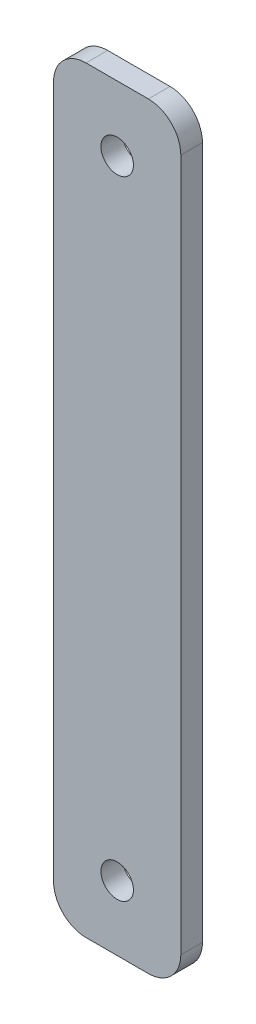
ISO-10303-21;
HEADER;
FILE_DESCRIPTION(('STEP AP214'),'2;1');
FILE_NAME('part.step','',(''),(''),'','','');
FILE_SCHEMA(('AUTOMOTIVE_DESIGN { 1 0 10303 214 1 1 1 1 }'));
ENDSEC;
DATA;
#1=APPLICATION_CONTEXT('core data for automotive mechanical design processes');
#2=APPLICATION_PROTOCOL_DEFINITION('international standard','automotive_design',2000,#1);
#3=PRODUCT_CONTEXT('',#1,'mechanical');
#4=PRODUCT('Part','Part','',(#3));
#5=PRODUCT_RELATED_PRODUCT_CATEGORY('part','',(#4));
#6=PRODUCT_DEFINITION_FORMATION('','',#4);
#7=PRODUCT_DEFINITION_CONTEXT('part definition',#1,'design');
#8=PRODUCT_DEFINITION('design','',#6,#7);
#9=PRODUCT_DEFINITION_SHAPE('','',#8);
#10=(LENGTH_UNIT() NAMED_UNIT(*) SI_UNIT(.MILLI.,.METRE.));
#11=(NAMED_UNIT(*) PLANE_ANGLE_UNIT() SI_UNIT($,.RADIAN.));
#12=(NAMED_UNIT(*) SI_UNIT($,.STERADIAN.) SOLID_ANGLE_UNIT());
#13=UNCERTAINTY_MEASURE_WITH_UNIT(LENGTH_MEASURE(1.E-05),#10,'distance_accuracy_value','');
#14=(GEOMETRIC_REPRESENTATION_CONTEXT(3) GLOBAL_UNCERTAINTY_ASSIGNED_CONTEXT((#13)) GLOBAL_UNIT_ASSIGNED_CONTEXT((#10,
#11,#12)) REPRESENTATION_CONTEXT('',''));
#15=CARTESIAN_POINT('',(0.,0.,0.));
#16=DIRECTION('',(0.,0.,1.));
#17=DIRECTION('',(1.,0.,0.));
#18=AXIS2_PLACEMENT_3D('',#15,#16,#17);
#19=CARTESIAN_POINT('',(-2.88,32.,2.));
#20=DIRECTION('',(0.,0.,1.));
#21=DIRECTION('',(1.,0.,0.));
#22=AXIS2_PLACEMENT_3D('',#19,#20,#21);
#23=PLANE('',#22);
#24=CARTESIAN_POINT('',(0.,-29.,2.));
#25=DIRECTION('',(0.,0.,1.));
#26=DIRECTION('',(1.,0.,0.));
#27=AXIS2_PLACEMENT_3D('',#24,#25,#26);
#28=CIRCLE('',#27,1.5);
#29=CARTESIAN_POINT('',(1.5,-29.,2.));
#30=VERTEX_POINT('',#29);
#31=EDGE_CURVE('E134',#30,#30,#28,.T.);
#32=ORIENTED_EDGE('',*,*,#31,.F.);
#33=EDGE_LOOP('',(#32));
#34=FACE_BOUND('',#33,.T.);
#35=CARTESIAN_POINT('',(-2.88,32.,2.));
#36=DIRECTION('',(0.,0.,1.));
#37=DIRECTION('',(1.,0.,0.));
#38=AXIS2_PLACEMENT_3D('',#35,#36,#37);
#39=CIRCLE('',#38,3.);
#40=CARTESIAN_POINT('',(-2.87999999999998,35.,2.));
#41=VERTEX_POINT('',#40);
#42=CARTESIAN_POINT('',(-5.88,32.,2.));
#43=VERTEX_POINT('',#42);
#44=EDGE_CURVE('E145',#41,#43,#39,.T.);
#45=ORIENTED_EDGE('',*,*,#44,.T.);
#46=DIRECTION('',(0.,-1.,0.));
#47=VECTOR('',#46,1.);
#48=CARTESIAN_POINT('',(-5.88,-32.,2.));
#49=LINE('',#48,#47);
#50=CARTESIAN_POINT('',(-5.88,-32.,2.));
#51=VERTEX_POINT('',#50);
#52=EDGE_CURVE('E93',#43,#51,#49,.T.);
#53=ORIENTED_EDGE('',*,*,#52,.T.);
#54=CARTESIAN_POINT('',(-2.88,-32.,2.));
#55=DIRECTION('',(0.,0.,1.));
#56=DIRECTION('',(-1.,0.,0.));
#57=AXIS2_PLACEMENT_3D('',#54,#55,#56);
#58=CIRCLE('',#57,3.);
#59=CARTESIAN_POINT('',(-2.87999999999998,-35.,2.));
#60=VERTEX_POINT('',#59);
#61=EDGE_CURVE('E160',#51,#60,#58,.T.);
#62=ORIENTED_EDGE('',*,*,#61,.T.);
#63=DIRECTION('',(1.,0.,0.));
#64=VECTOR('',#63,1.);
#65=CARTESIAN_POINT('',(2.87999999999998,-35.,2.));
#66=LINE('',#65,#64);
#67=CARTESIAN_POINT('',(2.87999999999998,-35.,2.));
#68=VERTEX_POINT('',#67);
#69=EDGE_CURVE('E173',#60,#68,#66,.T.);
#70=ORIENTED_EDGE('',*,*,#69,.T.);
#71=CARTESIAN_POINT('',(2.88,-32.,2.));
#72=DIRECTION('',(0.,0.,1.));
#73=DIRECTION('',(1.,0.,0.));
#74=AXIS2_PLACEMENT_3D('',#71,#72,#73);
#75=CIRCLE('',#74,3.);
#76=CARTESIAN_POINT('',(5.88,-32.,2.));
#77=VERTEX_POINT('',#76);
#78=EDGE_CURVE('E112',#68,#77,#75,.T.);
#79=ORIENTED_EDGE('',*,*,#78,.T.);
#80=DIRECTION('',(0.,1.,0.));
#81=VECTOR('',#80,1.);
#82=CARTESIAN_POINT('',(5.88,-32.,2.));
#83=LINE('',#82,#81);
#84=CARTESIAN_POINT('',(5.88,32.,2.));
#85=VERTEX_POINT('',#84);
#86=EDGE_CURVE('E106',#77,#85,#83,.T.);
#87=ORIENTED_EDGE('',*,*,#86,.T.);
#88=CARTESIAN_POINT('',(2.88,32.,2.));
#89=DIRECTION('',(0.,0.,1.));
#90=DIRECTION('',(1.,0.,0.));
#91=AXIS2_PLACEMENT_3D('',#88,#89,#90);
#92=CIRCLE('',#91,3.);
#93=CARTESIAN_POINT('',(2.87999999999998,35.,2.));
#94=VERTEX_POINT('',#93);
#95=EDGE_CURVE('E110',#85,#94,#92,.T.);
#96=ORIENTED_EDGE('',*,*,#95,.T.);
#97=DIRECTION('',(-1.,0.,0.));
#98=VECTOR('',#97,1.);
#99=CARTESIAN_POINT('',(2.87999999999998,35.,2.));
#100=LINE('',#99,#98);
#101=EDGE_CURVE('E50',#94,#41,#100,.T.);
#102=ORIENTED_EDGE('',*,*,#101,.T.);
#103=EDGE_LOOP('',(#45,#53,#62,#70,#79,#87,#96,#102));
#104=FACE_BOUND('',#103,.T.);
#105=CARTESIAN_POINT('',(0.,29.,2.));
#106=DIRECTION('',(0.,0.,1.));
#107=DIRECTION('',(1.,0.,0.));
#108=AXIS2_PLACEMENT_3D('',#105,#106,#107);
#109=CIRCLE('',#108,1.5);
#110=CARTESIAN_POINT('',(1.5,29.,2.));
#111=VERTEX_POINT('',#110);
#112=EDGE_CURVE('E182',#111,#111,#109,.T.);
#113=ORIENTED_EDGE('',*,*,#112,.F.);
#114=EDGE_LOOP('',(#113));
#115=FACE_BOUND('',#114,.T.);
#116=ADVANCED_FACE('F33',(#34,#104,#115),#23,.T.);
#117=CARTESIAN_POINT('',(-2.88,32.,0.));
#118=DIRECTION('',(0.,0.,1.));
#119=DIRECTION('',(1.,0.,0.));
#120=AXIS2_PLACEMENT_3D('',#117,#118,#119);
#121=PLANE('',#120);
#122=CARTESIAN_POINT('',(-2.88,32.,0.));
#123=DIRECTION('',(0.,0.,1.));
#124=DIRECTION('',(1.,0.,0.));
#125=AXIS2_PLACEMENT_3D('',#122,#123,#124);
#126=CIRCLE('',#125,3.);
#127=CARTESIAN_POINT('',(-2.87999999999998,35.,0.));
#128=VERTEX_POINT('',#127);
#129=CARTESIAN_POINT('',(-5.88,32.,0.));
#130=VERTEX_POINT('',#129);
#131=EDGE_CURVE('E130',#128,#130,#126,.T.);
#132=ORIENTED_EDGE('',*,*,#131,.F.);
#133=DIRECTION('',(-1.,0.,0.));
#134=VECTOR('',#133,1.);
#135=CARTESIAN_POINT('',(2.87999999999998,35.,0.));
#136=LINE('',#135,#134);
#137=CARTESIAN_POINT('',(2.87999999999998,35.,0.));
#138=VERTEX_POINT('',#137);
#139=EDGE_CURVE('E85',#138,#128,#136,.T.);
#140=ORIENTED_EDGE('',*,*,#139,.F.);
#141=CARTESIAN_POINT('',(2.88,32.,0.));
#142=DIRECTION('',(0.,0.,1.));
#143=DIRECTION('',(1.,0.,0.));
#144=AXIS2_PLACEMENT_3D('',#141,#142,#143);
#145=CIRCLE('',#144,3.);
#146=CARTESIAN_POINT('',(5.88,32.,0.));
#147=VERTEX_POINT('',#146);
#148=EDGE_CURVE('E79',#147,#138,#145,.T.);
#149=ORIENTED_EDGE('',*,*,#148,.F.);
#150=DIRECTION('',(0.,1.,0.));
#151=VECTOR('',#150,1.);
#152=CARTESIAN_POINT('',(5.88,-32.,0.));
#153=LINE('',#152,#151);
#154=CARTESIAN_POINT('',(5.88,-32.,0.));
#155=VERTEX_POINT('',#154);
#156=EDGE_CURVE('E120',#155,#147,#153,.T.);
#157=ORIENTED_EDGE('',*,*,#156,.F.);
#158=CARTESIAN_POINT('',(2.88,-32.,0.));
#159=DIRECTION('',(0.,0.,1.));
#160=DIRECTION('',(1.,0.,0.));
#161=AXIS2_PLACEMENT_3D('',#158,#159,#160);
#162=CIRCLE('',#161,3.);
#163=CARTESIAN_POINT('',(2.87999999999998,-35.,0.));
#164=VERTEX_POINT('',#163);
#165=EDGE_CURVE('E140',#164,#155,#162,.T.);
#166=ORIENTED_EDGE('',*,*,#165,.F.);
#167=DIRECTION('',(1.,0.,0.));
#168=VECTOR('',#167,1.);
#169=CARTESIAN_POINT('',(2.87999999999998,-35.,0.));
#170=LINE('',#169,#168);
#171=CARTESIAN_POINT('',(-2.87999999999998,-35.,0.));
#172=VERTEX_POINT('',#171);
#173=EDGE_CURVE('E138',#172,#164,#170,.T.);
#174=ORIENTED_EDGE('',*,*,#173,.F.);
#175=CARTESIAN_POINT('',(-2.88,-32.,0.));
#176=DIRECTION('',(0.,0.,1.));
#177=DIRECTION('',(-1.,0.,0.));
#178=AXIS2_PLACEMENT_3D('',#175,#176,#177);
#179=CIRCLE('',#178,3.);
#180=CARTESIAN_POINT('',(-5.88,-32.,0.));
#181=VERTEX_POINT('',#180);
#182=EDGE_CURVE('E136',#181,#172,#179,.T.);
#183=ORIENTED_EDGE('',*,*,#182,.F.);
#184=DIRECTION('',(0.,-1.,0.));
#185=VECTOR('',#184,1.);
#186=CARTESIAN_POINT('',(-5.88,-32.,0.));
#187=LINE('',#186,#185);
#188=EDGE_CURVE('E133',#130,#181,#187,.T.);
#189=ORIENTED_EDGE('',*,*,#188,.F.);
#190=EDGE_LOOP('',(#132,#140,#149,#157,#166,#174,#183,#189));
#191=FACE_BOUND('',#190,.T.);
#192=CARTESIAN_POINT('',(0.,-29.,0.));
#193=DIRECTION('',(0.,0.,1.));
#194=DIRECTION('',(1.,0.,0.));
#195=AXIS2_PLACEMENT_3D('',#192,#193,#194);
#196=CIRCLE('',#195,1.5);
#197=CARTESIAN_POINT('',(1.5,-29.,0.));
#198=VERTEX_POINT('',#197);
#199=EDGE_CURVE('E179',#198,#198,#196,.T.);
#200=ORIENTED_EDGE('',*,*,#199,.T.);
#201=EDGE_LOOP('',(#200));
#202=FACE_BOUND('',#201,.T.);
#203=CARTESIAN_POINT('',(0.,29.,0.));
#204=DIRECTION('',(0.,0.,1.));
#205=DIRECTION('',(1.,0.,0.));
#206=AXIS2_PLACEMENT_3D('',#203,#204,#205);
#207=CIRCLE('',#206,1.5);
#208=CARTESIAN_POINT('',(1.5,29.,0.));
#209=VERTEX_POINT('',#208);
#210=EDGE_CURVE('E185',#209,#209,#207,.T.);
#211=ORIENTED_EDGE('',*,*,#210,.T.);
#212=EDGE_LOOP('',(#211));
#213=FACE_BOUND('',#212,.T.);
#214=ADVANCED_FACE('F164',(#191,#202,#213),#121,.F.);
#215=CARTESIAN_POINT('',(-2.88,32.,2.));
#216=DIRECTION('',(0.,0.,-1.));
#217=DIRECTION('',(-1.,0.,0.));
#218=AXIS2_PLACEMENT_3D('',#215,#216,#217);
#219=CYLINDRICAL_SURFACE('',#218,3.);
#220=ORIENTED_EDGE('',*,*,#131,.T.);
#221=DIRECTION('',(0.,0.,-1.));
#222=VECTOR('',#221,1.);
#223=CARTESIAN_POINT('',(-5.88,32.,2.));
#224=LINE('',#223,#222);
#225=EDGE_CURVE('E11',#43,#130,#224,.T.);
#226=ORIENTED_EDGE('',*,*,#225,.F.);
#227=ORIENTED_EDGE('',*,*,#44,.F.);
#228=DIRECTION('',(0.,0.,-1.));
#229=VECTOR('',#228,1.);
#230=CARTESIAN_POINT('',(-2.87999999999998,35.,2.));
#231=LINE('',#230,#229);
#232=EDGE_CURVE('E126',#41,#128,#231,.T.);
#233=ORIENTED_EDGE('',*,*,#232,.T.);
#234=EDGE_LOOP('',(#220,#226,#227,#233));
#235=FACE_BOUND('',#234,.T.);
#236=ADVANCED_FACE('F35',(#235),#219,.T.);
#237=CARTESIAN_POINT('',(-5.88,-32.,2.));
#238=DIRECTION('',(1.,0.,0.));
#239=DIRECTION('',(0.,0.,-1.));
#240=AXIS2_PLACEMENT_3D('',#237,#238,#239);
#241=PLANE('',#240);
#242=ORIENTED_EDGE('',*,*,#188,.T.);
#243=DIRECTION('',(0.,0.,-1.));
#244=VECTOR('',#243,1.);
#245=CARTESIAN_POINT('',(-5.88,-32.,2.));
#246=LINE('',#245,#244);
#247=EDGE_CURVE('E42',#51,#181,#246,.T.);
#248=ORIENTED_EDGE('',*,*,#247,.F.);
#249=ORIENTED_EDGE('',*,*,#52,.F.);
#250=ORIENTED_EDGE('',*,*,#225,.T.);
#251=EDGE_LOOP('',(#242,#248,#249,#250));
#252=FACE_BOUND('',#251,.T.);
#253=ADVANCED_FACE('F217',(#252),#241,.F.);
#254=CARTESIAN_POINT('',(-2.88,-32.,2.));
#255=DIRECTION('',(0.,0.,-1.));
#256=DIRECTION('',(-1.,0.,0.));
#257=AXIS2_PLACEMENT_3D('',#254,#255,#256);
#258=CYLINDRICAL_SURFACE('',#257,3.);
#259=ORIENTED_EDGE('',*,*,#182,.T.);
#260=DIRECTION('',(0.,0.,-1.));
#261=VECTOR('',#260,1.);
#262=CARTESIAN_POINT('',(-2.87999999999998,-35.,2.));
#263=LINE('',#262,#261);
#264=EDGE_CURVE('E152',#60,#172,#263,.T.);
#265=ORIENTED_EDGE('',*,*,#264,.F.);
#266=ORIENTED_EDGE('',*,*,#61,.F.);
#267=ORIENTED_EDGE('',*,*,#247,.T.);
#268=EDGE_LOOP('',(#259,#265,#266,#267));
#269=FACE_BOUND('',#268,.T.);
#270=ADVANCED_FACE('F158',(#269),#258,.T.);
#271=CARTESIAN_POINT('',(2.87999999999998,-35.,2.));
#272=DIRECTION('',(0.,1.,0.));
#273=DIRECTION('',(-1.,0.,0.));
#274=AXIS2_PLACEMENT_3D('',#271,#272,#273);
#275=PLANE('',#274);
#276=ORIENTED_EDGE('',*,*,#173,.T.);
#277=DIRECTION('',(0.,0.,-1.));
#278=VECTOR('',#277,1.);
#279=CARTESIAN_POINT('',(2.87999999999998,-35.,2.));
#280=LINE('',#279,#278);
#281=EDGE_CURVE('E149',#68,#164,#280,.T.);
#282=ORIENTED_EDGE('',*,*,#281,.F.);
#283=ORIENTED_EDGE('',*,*,#69,.F.);
#284=ORIENTED_EDGE('',*,*,#264,.T.);
#285=EDGE_LOOP('',(#276,#282,#283,#284));
#286=FACE_BOUND('',#285,.T.);
#287=ADVANCED_FACE('F169',(#286),#275,.F.);
#288=CARTESIAN_POINT('',(2.88,-32.,2.));
#289=DIRECTION('',(0.,0.,-1.));
#290=DIRECTION('',(-1.,0.,0.));
#291=AXIS2_PLACEMENT_3D('',#288,#289,#290);
#292=CYLINDRICAL_SURFACE('',#291,3.);
#293=ORIENTED_EDGE('',*,*,#165,.T.);
#294=DIRECTION('',(0.,0.,-1.));
#295=VECTOR('',#294,1.);
#296=CARTESIAN_POINT('',(5.88,-32.,2.));
#297=LINE('',#296,#295);
#298=EDGE_CURVE('E121',#77,#155,#297,.T.);
#299=ORIENTED_EDGE('',*,*,#298,.F.);
#300=ORIENTED_EDGE('',*,*,#78,.F.);
#301=ORIENTED_EDGE('',*,*,#281,.T.);
#302=EDGE_LOOP('',(#293,#299,#300,#301));
#303=FACE_BOUND('',#302,.T.);
#304=ADVANCED_FACE('F172',(#303),#292,.T.);
#305=CARTESIAN_POINT('',(5.88,-32.,2.));
#306=DIRECTION('',(-1.,0.,0.));
#307=DIRECTION('',(0.,0.,1.));
#308=AXIS2_PLACEMENT_3D('',#305,#306,#307);
#309=PLANE('',#308);
#310=ORIENTED_EDGE('',*,*,#156,.T.);
#311=DIRECTION('',(0.,0.,-1.));
#312=VECTOR('',#311,1.);
#313=CARTESIAN_POINT('',(5.88,32.,2.));
#314=LINE('',#313,#312);
#315=EDGE_CURVE('E117',#85,#147,#314,.T.);
#316=ORIENTED_EDGE('',*,*,#315,.F.);
#317=ORIENTED_EDGE('',*,*,#86,.F.);
#318=ORIENTED_EDGE('',*,*,#298,.T.);
#319=EDGE_LOOP('',(#310,#316,#317,#318));
#320=FACE_BOUND('',#319,.T.);
#321=ADVANCED_FACE('F118',(#320),#309,.F.);
#322=CARTESIAN_POINT('',(2.88,32.,2.));
#323=DIRECTION('',(0.,0.,-1.));
#324=DIRECTION('',(-1.,0.,0.));
#325=AXIS2_PLACEMENT_3D('',#322,#323,#324);
#326=CYLINDRICAL_SURFACE('',#325,3.);
#327=ORIENTED_EDGE('',*,*,#148,.T.);
#328=DIRECTION('',(0.,0.,-1.));
#329=VECTOR('',#328,1.);
#330=CARTESIAN_POINT('',(2.87999999999998,35.,2.));
#331=LINE('',#330,#329);
#332=EDGE_CURVE('E122',#94,#138,#331,.T.);
#333=ORIENTED_EDGE('',*,*,#332,.F.);
#334=ORIENTED_EDGE('',*,*,#95,.F.);
#335=ORIENTED_EDGE('',*,*,#315,.T.);
#336=EDGE_LOOP('',(#327,#333,#334,#335));
#337=FACE_BOUND('',#336,.T.);
#338=ADVANCED_FACE('F124',(#337),#326,.T.);
#339=CARTESIAN_POINT('',(2.87999999999998,35.,2.));
#340=DIRECTION('',(0.,-1.,0.));
#341=DIRECTION('',(1.,0.,0.));
#342=AXIS2_PLACEMENT_3D('',#339,#340,#341);
#343=PLANE('',#342);
#344=ORIENTED_EDGE('',*,*,#139,.T.);
#345=ORIENTED_EDGE('',*,*,#232,.F.);
#346=ORIENTED_EDGE('',*,*,#101,.F.);
#347=ORIENTED_EDGE('',*,*,#332,.T.);
#348=EDGE_LOOP('',(#344,#345,#346,#347));
#349=FACE_BOUND('',#348,.T.);
#350=ADVANCED_FACE('F205',(#349),#343,.F.);
#351=CARTESIAN_POINT('',(0.,-29.,2.));
#352=DIRECTION('',(0.,0.,-1.));
#353=DIRECTION('',(-1.,0.,0.));
#354=AXIS2_PLACEMENT_3D('',#351,#352,#353);
#355=CYLINDRICAL_SURFACE('',#354,1.5);
#356=ORIENTED_EDGE('',*,*,#31,.T.);
#357=EDGE_LOOP('',(#356));
#358=FACE_BOUND('',#357,.T.);
#359=ORIENTED_EDGE('',*,*,#199,.F.);
#360=EDGE_LOOP('',(#359));
#361=FACE_BOUND('',#360,.T.);
#362=ADVANCED_FACE('F202',(#358,#361),#355,.F.);
#363=CARTESIAN_POINT('',(0.,29.,2.));
#364=DIRECTION('',(0.,0.,-1.));
#365=DIRECTION('',(-1.,0.,0.));
#366=AXIS2_PLACEMENT_3D('',#363,#364,#365);
#367=CYLINDRICAL_SURFACE('',#366,1.5);
#368=ORIENTED_EDGE('',*,*,#112,.T.);
#369=EDGE_LOOP('',(#368));
#370=FACE_BOUND('',#369,.T.);
#371=ORIENTED_EDGE('',*,*,#210,.F.);
#372=EDGE_LOOP('',(#371));
#373=FACE_BOUND('',#372,.T.);
#374=ADVANCED_FACE('F191',(#370,#373),#367,.F.);
#375=CLOSED_SHELL('',(#116,#214,#236,#253,#270,#287,#304,#321,#338,#350,#362,#374));
#376=MANIFOLD_SOLID_BREP('B2',#375);
#377=ADVANCED_BREP_SHAPE_REPRESENTATION('',(#18,#376),#14);
#378=SHAPE_DEFINITION_REPRESENTATION(#9,#377);
ENDSEC;
END-ISO-10303-21;
